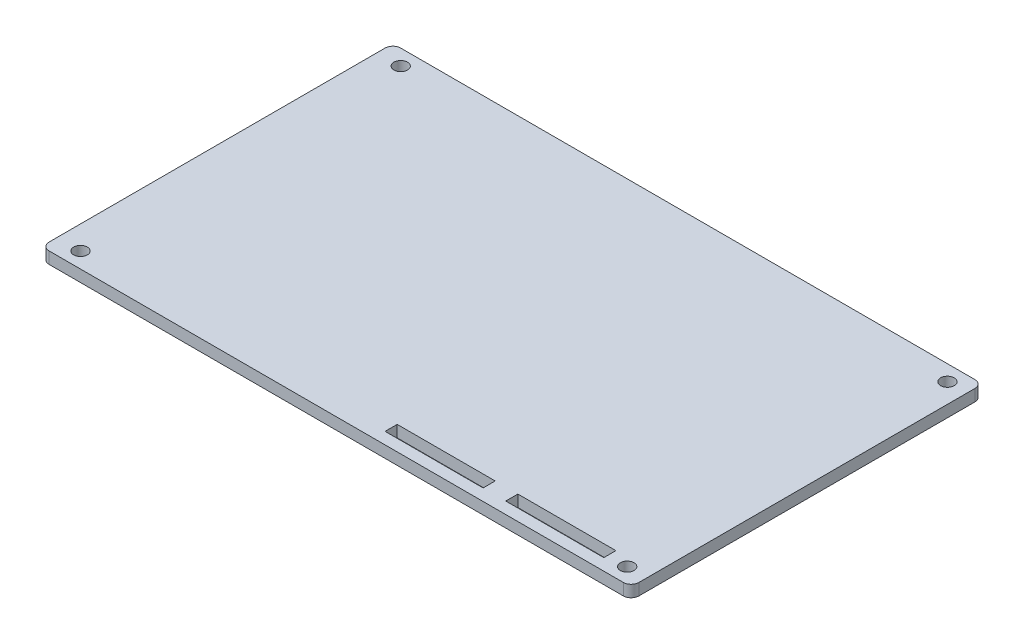
ISO-10303-21;
HEADER;
FILE_DESCRIPTION(('STEP AP214'),'2;1');
FILE_NAME('part.step','',(''),(''),'','','');
FILE_SCHEMA(('AUTOMOTIVE_DESIGN { 1 0 10303 214 1 1 1 1 }'));
ENDSEC;
DATA;
#1=APPLICATION_CONTEXT('core data for automotive mechanical design processes');
#2=APPLICATION_PROTOCOL_DEFINITION('international standard','automotive_design',2000,#1);
#3=PRODUCT_CONTEXT('',#1,'mechanical');
#4=PRODUCT('Part','Part','',(#3));
#5=PRODUCT_RELATED_PRODUCT_CATEGORY('part','',(#4));
#6=PRODUCT_DEFINITION_FORMATION('','',#4);
#7=PRODUCT_DEFINITION_CONTEXT('part definition',#1,'design');
#8=PRODUCT_DEFINITION('design','',#6,#7);
#9=PRODUCT_DEFINITION_SHAPE('','',#8);
#10=(LENGTH_UNIT() NAMED_UNIT(*) SI_UNIT(.MILLI.,.METRE.));
#11=(NAMED_UNIT(*) PLANE_ANGLE_UNIT() SI_UNIT($,.RADIAN.));
#12=(NAMED_UNIT(*) SI_UNIT($,.STERADIAN.) SOLID_ANGLE_UNIT());
#13=UNCERTAINTY_MEASURE_WITH_UNIT(LENGTH_MEASURE(1.E-05),#10,'distance_accuracy_value','');
#14=(GEOMETRIC_REPRESENTATION_CONTEXT(3) GLOBAL_UNCERTAINTY_ASSIGNED_CONTEXT((#13)) GLOBAL_UNIT_ASSIGNED_CONTEXT((#10,
#11,#12)) REPRESENTATION_CONTEXT('',''));
#15=CARTESIAN_POINT('',(0.,0.,0.));
#16=DIRECTION('',(0.,0.,1.));
#17=DIRECTION('',(1.,0.,0.));
#18=AXIS2_PLACEMENT_3D('',#15,#16,#17);
#19=CARTESIAN_POINT('',(0.,3.,0.));
#20=DIRECTION('',(1.,0.,0.));
#21=DIRECTION('',(0.,0.,-1.));
#22=AXIS2_PLACEMENT_3D('',#19,#20,#21);
#23=PLANE('',#22);
#24=DIRECTION('',(0.,0.,1.));
#25=VECTOR('',#24,1.);
#26=CARTESIAN_POINT('',(0.,0.,0.));
#27=LINE('',#26,#25);
#28=CARTESIAN_POINT('',(0.,0.,-88.));
#29=VERTEX_POINT('',#28);
#30=CARTESIAN_POINT('',(0.,0.,-2.));
#31=VERTEX_POINT('',#30);
#32=EDGE_CURVE('E279',#29,#31,#27,.T.);
#33=ORIENTED_EDGE('',*,*,#32,.T.);
#34=DIRECTION('',(0.,-1.,0.));
#35=VECTOR('',#34,1.);
#36=CARTESIAN_POINT('',(0.,3.,-2.));
#37=LINE('',#36,#35);
#38=CARTESIAN_POINT('',(0.,3.,-2.));
#39=VERTEX_POINT('',#38);
#40=EDGE_CURVE('E11',#31,#39,#37,.F.);
#41=ORIENTED_EDGE('',*,*,#40,.T.);
#42=DIRECTION('',(0.,0.,1.));
#43=VECTOR('',#42,1.);
#44=CARTESIAN_POINT('',(0.,3.,0.));
#45=LINE('',#44,#43);
#46=CARTESIAN_POINT('',(0.,3.,-88.));
#47=VERTEX_POINT('',#46);
#48=EDGE_CURVE('E283',#47,#39,#45,.T.);
#49=ORIENTED_EDGE('',*,*,#48,.F.);
#50=DIRECTION('',(0.,-1.,0.));
#51=VECTOR('',#50,1.);
#52=CARTESIAN_POINT('',(0.,3.,-88.));
#53=LINE('',#52,#51);
#54=EDGE_CURVE('E53',#47,#29,#53,.T.);
#55=ORIENTED_EDGE('',*,*,#54,.T.);
#56=EDGE_LOOP('',(#33,#41,#49,#55));
#57=FACE_BOUND('',#56,.T.);
#58=ADVANCED_FACE('F44',(#57),#23,.F.);
#59=CARTESIAN_POINT('',(0.,3.,0.));
#60=DIRECTION('',(0.,0.,-1.));
#61=DIRECTION('',(-1.,0.,0.));
#62=AXIS2_PLACEMENT_3D('',#59,#60,#61);
#63=PLANE('',#62);
#64=DIRECTION('',(1.,0.,0.));
#65=VECTOR('',#64,1.);
#66=CARTESIAN_POINT('',(0.,0.,0.));
#67=LINE('',#66,#65);
#68=CARTESIAN_POINT('',(2.,0.,0.));
#69=VERTEX_POINT('',#68);
#70=CARTESIAN_POINT('',(149.,0.,0.));
#71=VERTEX_POINT('',#70);
#72=EDGE_CURVE('E304',#69,#71,#67,.T.);
#73=ORIENTED_EDGE('',*,*,#72,.T.);
#74=DIRECTION('',(0.,-1.,0.));
#75=VECTOR('',#74,1.);
#76=CARTESIAN_POINT('',(149.,3.,0.));
#77=LINE('',#76,#75);
#78=CARTESIAN_POINT('',(149.,3.,0.));
#79=VERTEX_POINT('',#78);
#80=EDGE_CURVE('E356',#71,#79,#77,.F.);
#81=ORIENTED_EDGE('',*,*,#80,.T.);
#82=DIRECTION('',(1.,0.,0.));
#83=VECTOR('',#82,1.);
#84=CARTESIAN_POINT('',(0.,3.,0.));
#85=LINE('',#84,#83);
#86=CARTESIAN_POINT('',(2.,3.,0.));
#87=VERTEX_POINT('',#86);
#88=EDGE_CURVE('E287',#87,#79,#85,.T.);
#89=ORIENTED_EDGE('',*,*,#88,.F.);
#90=DIRECTION('',(0.,-1.,0.));
#91=VECTOR('',#90,1.);
#92=CARTESIAN_POINT('',(2.,3.,0.));
#93=LINE('',#92,#91);
#94=EDGE_CURVE('E352',#87,#69,#93,.T.);
#95=ORIENTED_EDGE('',*,*,#94,.T.);
#96=EDGE_LOOP('',(#73,#81,#89,#95));
#97=FACE_BOUND('',#96,.T.);
#98=ADVANCED_FACE('F376',(#97),#63,.F.);
#99=CARTESIAN_POINT('',(151.,3.,0.));
#100=DIRECTION('',(-1.,0.,0.));
#101=DIRECTION('',(0.,0.,1.));
#102=AXIS2_PLACEMENT_3D('',#99,#100,#101);
#103=PLANE('',#102);
#104=DIRECTION('',(0.,0.,-1.));
#105=VECTOR('',#104,1.);
#106=CARTESIAN_POINT('',(151.,0.,0.));
#107=LINE('',#106,#105);
#108=CARTESIAN_POINT('',(151.,0.,-2.));
#109=VERTEX_POINT('',#108);
#110=CARTESIAN_POINT('',(151.,0.,-88.));
#111=VERTEX_POINT('',#110);
#112=EDGE_CURVE('E308',#109,#111,#107,.T.);
#113=ORIENTED_EDGE('',*,*,#112,.T.);
#114=DIRECTION('',(0.,-1.,0.));
#115=VECTOR('',#114,1.);
#116=CARTESIAN_POINT('',(151.,3.,-88.));
#117=LINE('',#116,#115);
#118=CARTESIAN_POINT('',(151.,3.,-88.));
#119=VERTEX_POINT('',#118);
#120=EDGE_CURVE('E337',#111,#119,#117,.F.);
#121=ORIENTED_EDGE('',*,*,#120,.T.);
#122=DIRECTION('',(0.,0.,-1.));
#123=VECTOR('',#122,1.);
#124=CARTESIAN_POINT('',(151.,3.,0.));
#125=LINE('',#124,#123);
#126=CARTESIAN_POINT('',(151.,3.,-2.));
#127=VERTEX_POINT('',#126);
#128=EDGE_CURVE('E292',#127,#119,#125,.T.);
#129=ORIENTED_EDGE('',*,*,#128,.F.);
#130=DIRECTION('',(0.,-1.,0.));
#131=VECTOR('',#130,1.);
#132=CARTESIAN_POINT('',(151.,3.,-2.));
#133=LINE('',#132,#131);
#134=EDGE_CURVE('E333',#127,#109,#133,.T.);
#135=ORIENTED_EDGE('',*,*,#134,.T.);
#136=EDGE_LOOP('',(#113,#121,#129,#135));
#137=FACE_BOUND('',#136,.T.);
#138=ADVANCED_FACE('F387',(#137),#103,.F.);
#139=CARTESIAN_POINT('',(0.,3.,-90.));
#140=DIRECTION('',(0.,0.,1.));
#141=DIRECTION('',(1.,0.,0.));
#142=AXIS2_PLACEMENT_3D('',#139,#140,#141);
#143=PLANE('',#142);
#144=DIRECTION('',(-1.,0.,0.));
#145=VECTOR('',#144,1.);
#146=CARTESIAN_POINT('',(0.,3.,-90.));
#147=LINE('',#146,#145);
#148=CARTESIAN_POINT('',(149.,3.,-90.));
#149=VERTEX_POINT('',#148);
#150=CARTESIAN_POINT('',(2.,3.,-90.));
#151=VERTEX_POINT('',#150);
#152=EDGE_CURVE('E296',#149,#151,#147,.T.);
#153=ORIENTED_EDGE('',*,*,#152,.F.);
#154=DIRECTION('',(0.,-1.,0.));
#155=VECTOR('',#154,1.);
#156=CARTESIAN_POINT('',(149.,3.,-90.));
#157=LINE('',#156,#155);
#158=CARTESIAN_POINT('',(149.,0.,-90.));
#159=VERTEX_POINT('',#158);
#160=EDGE_CURVE('E317',#149,#159,#157,.T.);
#161=ORIENTED_EDGE('',*,*,#160,.T.);
#162=DIRECTION('',(-1.,0.,0.));
#163=VECTOR('',#162,1.);
#164=CARTESIAN_POINT('',(0.,0.,-90.));
#165=LINE('',#164,#163);
#166=CARTESIAN_POINT('',(2.,0.,-90.));
#167=VERTEX_POINT('',#166);
#168=EDGE_CURVE('E288',#159,#167,#165,.T.);
#169=ORIENTED_EDGE('',*,*,#168,.T.);
#170=DIRECTION('',(0.,-1.,0.));
#171=VECTOR('',#170,1.);
#172=CARTESIAN_POINT('',(2.,3.,-90.));
#173=LINE('',#172,#171);
#174=EDGE_CURVE('E300',#167,#151,#173,.F.);
#175=ORIENTED_EDGE('',*,*,#174,.T.);
#176=EDGE_LOOP('',(#153,#161,#169,#175));
#177=FACE_BOUND('',#176,.T.);
#178=ADVANCED_FACE('F395',(#177),#143,.F.);
#179=CARTESIAN_POINT('',(0.,3.,0.));
#180=DIRECTION('',(0.,-1.,0.));
#181=DIRECTION('',(0.,0.,-1.));
#182=AXIS2_PLACEMENT_3D('',#179,#180,#181);
#183=PLANE('',#182);
#184=DIRECTION('',(-1.,0.,0.));
#185=VECTOR('',#184,1.);
#186=CARTESIAN_POINT('',(141.,3.,-6.09999999999999));
#187=LINE('',#186,#185);
#188=CARTESIAN_POINT('',(141.,3.,-6.09999999999999));
#189=VERTEX_POINT('',#188);
#190=CARTESIAN_POINT('',(115.9,3.,-6.09999999999999));
#191=VERTEX_POINT('',#190);
#192=EDGE_CURVE('E194',#189,#191,#187,.T.);
#193=ORIENTED_EDGE('',*,*,#192,.F.);
#194=DIRECTION('',(0.,0.,-1.));
#195=VECTOR('',#194,1.);
#196=CARTESIAN_POINT('',(141.,3.,-3.));
#197=LINE('',#196,#195);
#198=CARTESIAN_POINT('',(141.,3.,-3.));
#199=VERTEX_POINT('',#198);
#200=EDGE_CURVE('E60',#199,#189,#197,.T.);
#201=ORIENTED_EDGE('',*,*,#200,.F.);
#202=DIRECTION('',(1.,0.,0.));
#203=VECTOR('',#202,1.);
#204=CARTESIAN_POINT('',(141.,3.,-3.));
#205=LINE('',#204,#203);
#206=CARTESIAN_POINT('',(115.9,3.,-3.));
#207=VERTEX_POINT('',#206);
#208=EDGE_CURVE('E181',#207,#199,#205,.T.);
#209=ORIENTED_EDGE('',*,*,#208,.F.);
#210=DIRECTION('',(0.,0.,1.));
#211=VECTOR('',#210,1.);
#212=CARTESIAN_POINT('',(115.9,3.,-3.));
#213=LINE('',#212,#211);
#214=EDGE_CURVE('E185',#191,#207,#213,.T.);
#215=ORIENTED_EDGE('',*,*,#214,.F.);
#216=EDGE_LOOP('',(#193,#201,#209,#215));
#217=FACE_BOUND('',#216,.T.);
#218=DIRECTION('',(1.,0.,0.));
#219=VECTOR('',#218,1.);
#220=CARTESIAN_POINT('',(85.,3.,-2.99999999999999));
#221=LINE('',#220,#219);
#222=CARTESIAN_POINT('',(85.,3.,-2.99999999999999));
#223=VERTEX_POINT('',#222);
#224=CARTESIAN_POINT('',(110.1,3.,-2.99999999999999));
#225=VERTEX_POINT('',#224);
#226=EDGE_CURVE('E231',#223,#225,#221,.T.);
#227=ORIENTED_EDGE('',*,*,#226,.F.);
#228=DIRECTION('',(0.,0.,1.));
#229=VECTOR('',#228,1.);
#230=CARTESIAN_POINT('',(85.,3.,-2.99999999999999));
#231=LINE('',#230,#229);
#232=CARTESIAN_POINT('',(85.,3.,-6.09999999999999));
#233=VERTEX_POINT('',#232);
#234=EDGE_CURVE('E68',#233,#223,#231,.T.);
#235=ORIENTED_EDGE('',*,*,#234,.F.);
#236=DIRECTION('',(-1.,0.,0.));
#237=VECTOR('',#236,1.);
#238=CARTESIAN_POINT('',(85.,3.,-6.09999999999999));
#239=LINE('',#238,#237);
#240=CARTESIAN_POINT('',(110.1,3.,-6.09999999999999));
#241=VERTEX_POINT('',#240);
#242=EDGE_CURVE('E222',#241,#233,#239,.T.);
#243=ORIENTED_EDGE('',*,*,#242,.F.);
#244=DIRECTION('',(0.,0.,-1.));
#245=VECTOR('',#244,1.);
#246=CARTESIAN_POINT('',(110.1,3.,-2.99999999999999));
#247=LINE('',#246,#245);
#248=EDGE_CURVE('E226',#225,#241,#247,.T.);
#249=ORIENTED_EDGE('',*,*,#248,.F.);
#250=EDGE_LOOP('',(#227,#235,#243,#249));
#251=FACE_BOUND('',#250,.T.);
#252=CARTESIAN_POINT('',(146.,3.,-4.));
#253=DIRECTION('',(0.,1.,0.));
#254=DIRECTION('',(0.,0.,1.));
#255=AXIS2_PLACEMENT_3D('',#252,#253,#254);
#256=CIRCLE('',#255,1.75000000000001);
#257=CARTESIAN_POINT('',(146.,3.,-2.24999999999999));
#258=VERTEX_POINT('',#257);
#259=EDGE_CURVE('E259',#258,#258,#256,.T.);
#260=ORIENTED_EDGE('',*,*,#259,.F.);
#261=EDGE_LOOP('',(#260));
#262=FACE_BOUND('',#261,.T.);
#263=CARTESIAN_POINT('',(6.,3.,-86.));
#264=DIRECTION('',(0.,1.,0.));
#265=DIRECTION('',(0.,0.,1.));
#266=AXIS2_PLACEMENT_3D('',#263,#264,#265);
#267=CIRCLE('',#266,1.75);
#268=CARTESIAN_POINT('',(6.,3.,-84.25));
#269=VERTEX_POINT('',#268);
#270=EDGE_CURVE('E268',#269,#269,#267,.T.);
#271=ORIENTED_EDGE('',*,*,#270,.F.);
#272=EDGE_LOOP('',(#271));
#273=FACE_BOUND('',#272,.T.);
#274=CARTESIAN_POINT('',(6.,3.,-4.));
#275=DIRECTION('',(0.,1.,0.));
#276=DIRECTION('',(0.,0.,1.));
#277=AXIS2_PLACEMENT_3D('',#274,#275,#276);
#278=CIRCLE('',#277,1.75);
#279=CARTESIAN_POINT('',(6.,3.,-2.25));
#280=VERTEX_POINT('',#279);
#281=EDGE_CURVE('E251',#280,#280,#278,.T.);
#282=ORIENTED_EDGE('',*,*,#281,.F.);
#283=EDGE_LOOP('',(#282));
#284=FACE_BOUND('',#283,.T.);
#285=CARTESIAN_POINT('',(146.,3.,-86.));
#286=DIRECTION('',(0.,1.,0.));
#287=DIRECTION('',(0.,0.,1.));
#288=AXIS2_PLACEMENT_3D('',#285,#286,#287);
#289=CIRCLE('',#288,1.75000000000001);
#290=CARTESIAN_POINT('',(146.,3.,-84.25));
#291=VERTEX_POINT('',#290);
#292=EDGE_CURVE('E263',#291,#291,#289,.T.);
#293=ORIENTED_EDGE('',*,*,#292,.F.);
#294=EDGE_LOOP('',(#293));
#295=FACE_BOUND('',#294,.T.);
#296=ORIENTED_EDGE('',*,*,#128,.T.);
#297=CARTESIAN_POINT('',(149.,3.,-88.));
#298=DIRECTION('',(0.,-1.,0.));
#299=DIRECTION('',(0.,0.,-1.));
#300=AXIS2_PLACEMENT_3D('',#297,#298,#299);
#301=CIRCLE('',#300,2.);
#302=EDGE_CURVE('E349',#119,#149,#301,.F.);
#303=ORIENTED_EDGE('',*,*,#302,.T.);
#304=ORIENTED_EDGE('',*,*,#152,.T.);
#305=CARTESIAN_POINT('',(2.,3.,-88.));
#306=DIRECTION('',(0.,-1.,0.));
#307=DIRECTION('',(0.,0.,-1.));
#308=AXIS2_PLACEMENT_3D('',#305,#306,#307);
#309=CIRCLE('',#308,2.);
#310=EDGE_CURVE('E340',#151,#47,#309,.F.);
#311=ORIENTED_EDGE('',*,*,#310,.T.);
#312=ORIENTED_EDGE('',*,*,#48,.T.);
#313=CARTESIAN_POINT('',(2.,3.,-2.));
#314=DIRECTION('',(0.,-1.,0.));
#315=DIRECTION('',(0.,0.,-1.));
#316=AXIS2_PLACEMENT_3D('',#313,#314,#315);
#317=CIRCLE('',#316,2.);
#318=EDGE_CURVE('E343',#39,#87,#317,.F.);
#319=ORIENTED_EDGE('',*,*,#318,.T.);
#320=ORIENTED_EDGE('',*,*,#88,.T.);
#321=CARTESIAN_POINT('',(149.,3.,-2.));
#322=DIRECTION('',(0.,-1.,0.));
#323=DIRECTION('',(0.,0.,-1.));
#324=AXIS2_PLACEMENT_3D('',#321,#322,#323);
#325=CIRCLE('',#324,2.);
#326=EDGE_CURVE('E346',#79,#127,#325,.F.);
#327=ORIENTED_EDGE('',*,*,#326,.T.);
#328=EDGE_LOOP('',(#296,#303,#304,#311,#312,#319,#320,#327));
#329=FACE_BOUND('',#328,.T.);
#330=ADVANCED_FACE('F380',(#217,#251,#262,#273,#284,#295,#329),#183,.F.);
#331=CARTESIAN_POINT('',(0.,0.,0.));
#332=DIRECTION('',(0.,-1.,0.));
#333=DIRECTION('',(0.,0.,-1.));
#334=AXIS2_PLACEMENT_3D('',#331,#332,#333);
#335=PLANE('',#334);
#336=DIRECTION('',(0.,0.,-1.));
#337=VECTOR('',#336,1.);
#338=CARTESIAN_POINT('',(141.,0.,-3.));
#339=LINE('',#338,#337);
#340=CARTESIAN_POINT('',(141.,0.,-3.));
#341=VERTEX_POINT('',#340);
#342=CARTESIAN_POINT('',(141.,0.,-6.09999999999999));
#343=VERTEX_POINT('',#342);
#344=EDGE_CURVE('E159',#341,#343,#339,.T.);
#345=ORIENTED_EDGE('',*,*,#344,.T.);
#346=DIRECTION('',(-1.,0.,0.));
#347=VECTOR('',#346,1.);
#348=CARTESIAN_POINT('',(141.,0.,-6.09999999999999));
#349=LINE('',#348,#347);
#350=CARTESIAN_POINT('',(115.9,0.,-6.09999999999999));
#351=VERTEX_POINT('',#350);
#352=EDGE_CURVE('E170',#343,#351,#349,.T.);
#353=ORIENTED_EDGE('',*,*,#352,.T.);
#354=DIRECTION('',(0.,0.,1.));
#355=VECTOR('',#354,1.);
#356=CARTESIAN_POINT('',(115.9,0.,-3.));
#357=LINE('',#356,#355);
#358=CARTESIAN_POINT('',(115.9,0.,-3.));
#359=VERTEX_POINT('',#358);
#360=EDGE_CURVE('E175',#351,#359,#357,.T.);
#361=ORIENTED_EDGE('',*,*,#360,.T.);
#362=DIRECTION('',(1.,0.,0.));
#363=VECTOR('',#362,1.);
#364=CARTESIAN_POINT('',(141.,0.,-3.));
#365=LINE('',#364,#363);
#366=EDGE_CURVE('E166',#359,#341,#365,.T.);
#367=ORIENTED_EDGE('',*,*,#366,.T.);
#368=EDGE_LOOP('',(#345,#353,#361,#367));
#369=FACE_BOUND('',#368,.T.);
#370=DIRECTION('',(0.,0.,1.));
#371=VECTOR('',#370,1.);
#372=CARTESIAN_POINT('',(85.,0.,-2.99999999999999));
#373=LINE('',#372,#371);
#374=CARTESIAN_POINT('',(85.,0.,-6.09999999999999));
#375=VERTEX_POINT('',#374);
#376=CARTESIAN_POINT('',(85.,0.,-2.99999999999999));
#377=VERTEX_POINT('',#376);
#378=EDGE_CURVE('E227',#375,#377,#373,.T.);
#379=ORIENTED_EDGE('',*,*,#378,.T.);
#380=DIRECTION('',(1.,0.,0.));
#381=VECTOR('',#380,1.);
#382=CARTESIAN_POINT('',(85.,0.,-2.99999999999999));
#383=LINE('',#382,#381);
#384=CARTESIAN_POINT('',(110.1,0.,-2.99999999999999));
#385=VERTEX_POINT('',#384);
#386=EDGE_CURVE('E244',#377,#385,#383,.T.);
#387=ORIENTED_EDGE('',*,*,#386,.T.);
#388=DIRECTION('',(0.,0.,-1.));
#389=VECTOR('',#388,1.);
#390=CARTESIAN_POINT('',(110.1,0.,-2.99999999999999));
#391=LINE('',#390,#389);
#392=CARTESIAN_POINT('',(110.1,0.,-6.09999999999999));
#393=VERTEX_POINT('',#392);
#394=EDGE_CURVE('E240',#385,#393,#391,.T.);
#395=ORIENTED_EDGE('',*,*,#394,.T.);
#396=DIRECTION('',(-1.,0.,0.));
#397=VECTOR('',#396,1.);
#398=CARTESIAN_POINT('',(85.,0.,-6.09999999999999));
#399=LINE('',#398,#397);
#400=EDGE_CURVE('E212',#393,#375,#399,.T.);
#401=ORIENTED_EDGE('',*,*,#400,.T.);
#402=EDGE_LOOP('',(#379,#387,#395,#401));
#403=FACE_BOUND('',#402,.T.);
#404=CARTESIAN_POINT('',(146.,0.,-4.));
#405=DIRECTION('',(0.,1.,0.));
#406=DIRECTION('',(0.,0.,1.));
#407=AXIS2_PLACEMENT_3D('',#404,#405,#406);
#408=CIRCLE('',#407,1.75000000000001);
#409=CARTESIAN_POINT('',(146.,0.,-2.24999999999999));
#410=VERTEX_POINT('',#409);
#411=EDGE_CURVE('E264',#410,#410,#408,.T.);
#412=ORIENTED_EDGE('',*,*,#411,.T.);
#413=EDGE_LOOP('',(#412));
#414=FACE_BOUND('',#413,.T.);
#415=CARTESIAN_POINT('',(6.,0.,-86.));
#416=DIRECTION('',(0.,1.,0.));
#417=DIRECTION('',(0.,0.,1.));
#418=AXIS2_PLACEMENT_3D('',#415,#416,#417);
#419=CIRCLE('',#418,1.75);
#420=CARTESIAN_POINT('',(6.,0.,-84.25));
#421=VERTEX_POINT('',#420);
#422=EDGE_CURVE('E255',#421,#421,#419,.T.);
#423=ORIENTED_EDGE('',*,*,#422,.T.);
#424=EDGE_LOOP('',(#423));
#425=FACE_BOUND('',#424,.T.);
#426=CARTESIAN_POINT('',(6.,0.,-4.));
#427=DIRECTION('',(0.,1.,0.));
#428=DIRECTION('',(0.,0.,1.));
#429=AXIS2_PLACEMENT_3D('',#426,#427,#428);
#430=CIRCLE('',#429,1.75);
#431=CARTESIAN_POINT('',(6.,0.,-2.25));
#432=VERTEX_POINT('',#431);
#433=EDGE_CURVE('E203',#432,#432,#430,.T.);
#434=ORIENTED_EDGE('',*,*,#433,.T.);
#435=EDGE_LOOP('',(#434));
#436=FACE_BOUND('',#435,.T.);
#437=CARTESIAN_POINT('',(146.,0.,-86.));
#438=DIRECTION('',(0.,1.,0.));
#439=DIRECTION('',(0.,0.,1.));
#440=AXIS2_PLACEMENT_3D('',#437,#438,#439);
#441=CIRCLE('',#440,1.75000000000001);
#442=CARTESIAN_POINT('',(146.,0.,-84.25));
#443=VERTEX_POINT('',#442);
#444=EDGE_CURVE('E275',#443,#443,#441,.T.);
#445=ORIENTED_EDGE('',*,*,#444,.T.);
#446=EDGE_LOOP('',(#445));
#447=FACE_BOUND('',#446,.T.);
#448=ORIENTED_EDGE('',*,*,#168,.F.);
#449=CARTESIAN_POINT('',(149.,0.,-88.));
#450=DIRECTION('',(0.,-1.,0.));
#451=DIRECTION('',(0.,0.,-1.));
#452=AXIS2_PLACEMENT_3D('',#449,#450,#451);
#453=CIRCLE('',#452,2.);
#454=EDGE_CURVE('E330',#159,#111,#453,.T.);
#455=ORIENTED_EDGE('',*,*,#454,.T.);
#456=ORIENTED_EDGE('',*,*,#112,.F.);
#457=CARTESIAN_POINT('',(149.,0.,-2.));
#458=DIRECTION('',(0.,-1.,0.));
#459=DIRECTION('',(0.,0.,-1.));
#460=AXIS2_PLACEMENT_3D('',#457,#458,#459);
#461=CIRCLE('',#460,2.);
#462=EDGE_CURVE('E327',#109,#71,#461,.T.);
#463=ORIENTED_EDGE('',*,*,#462,.T.);
#464=ORIENTED_EDGE('',*,*,#72,.F.);
#465=CARTESIAN_POINT('',(2.,0.,-2.));
#466=DIRECTION('',(0.,-1.,0.));
#467=DIRECTION('',(0.,0.,-1.));
#468=AXIS2_PLACEMENT_3D('',#465,#466,#467);
#469=CIRCLE('',#468,2.);
#470=EDGE_CURVE('E324',#69,#31,#469,.T.);
#471=ORIENTED_EDGE('',*,*,#470,.T.);
#472=ORIENTED_EDGE('',*,*,#32,.F.);
#473=CARTESIAN_POINT('',(2.,0.,-88.));
#474=DIRECTION('',(0.,-1.,0.));
#475=DIRECTION('',(0.,0.,-1.));
#476=AXIS2_PLACEMENT_3D('',#473,#474,#475);
#477=CIRCLE('',#476,2.);
#478=EDGE_CURVE('E321',#29,#167,#477,.T.);
#479=ORIENTED_EDGE('',*,*,#478,.T.);
#480=EDGE_LOOP('',(#448,#455,#456,#463,#464,#471,#472,#479));
#481=FACE_BOUND('',#480,.T.);
#482=ADVANCED_FACE('F177',(#369,#403,#414,#425,#436,#447,#481),#335,.T.);
#483=CARTESIAN_POINT('',(146.,0.,-86.));
#484=DIRECTION('',(0.,1.,0.));
#485=DIRECTION('',(0.,0.,1.));
#486=AXIS2_PLACEMENT_3D('',#483,#484,#485);
#487=CYLINDRICAL_SURFACE('',#486,1.75000000000001);
#488=ORIENTED_EDGE('',*,*,#444,.F.);
#489=EDGE_LOOP('',(#488));
#490=FACE_BOUND('',#489,.T.);
#491=ORIENTED_EDGE('',*,*,#292,.T.);
#492=EDGE_LOOP('',(#491));
#493=FACE_BOUND('',#492,.T.);
#494=ADVANCED_FACE('F514',(#490,#493),#487,.F.);
#495=CARTESIAN_POINT('',(6.,0.,-4.));
#496=DIRECTION('',(0.,1.,0.));
#497=DIRECTION('',(0.,0.,1.));
#498=AXIS2_PLACEMENT_3D('',#495,#496,#497);
#499=CYLINDRICAL_SURFACE('',#498,1.75);
#500=ORIENTED_EDGE('',*,*,#433,.F.);
#501=EDGE_LOOP('',(#500));
#502=FACE_BOUND('',#501,.T.);
#503=ORIENTED_EDGE('',*,*,#281,.T.);
#504=EDGE_LOOP('',(#503));
#505=FACE_BOUND('',#504,.T.);
#506=ADVANCED_FACE('F510',(#502,#505),#499,.F.);
#507=CARTESIAN_POINT('',(6.,0.,-86.));
#508=DIRECTION('',(0.,1.,0.));
#509=DIRECTION('',(0.,0.,1.));
#510=AXIS2_PLACEMENT_3D('',#507,#508,#509);
#511=CYLINDRICAL_SURFACE('',#510,1.75);
#512=ORIENTED_EDGE('',*,*,#422,.F.);
#513=EDGE_LOOP('',(#512));
#514=FACE_BOUND('',#513,.T.);
#515=ORIENTED_EDGE('',*,*,#270,.T.);
#516=EDGE_LOOP('',(#515));
#517=FACE_BOUND('',#516,.T.);
#518=ADVANCED_FACE('F513',(#514,#517),#511,.F.);
#519=CARTESIAN_POINT('',(146.,0.,-4.));
#520=DIRECTION('',(0.,1.,0.));
#521=DIRECTION('',(0.,0.,1.));
#522=AXIS2_PLACEMENT_3D('',#519,#520,#521);
#523=CYLINDRICAL_SURFACE('',#522,1.75000000000001);
#524=ORIENTED_EDGE('',*,*,#411,.F.);
#525=EDGE_LOOP('',(#524));
#526=FACE_BOUND('',#525,.T.);
#527=ORIENTED_EDGE('',*,*,#259,.T.);
#528=EDGE_LOOP('',(#527));
#529=FACE_BOUND('',#528,.T.);
#530=ADVANCED_FACE('F417',(#526,#529),#523,.F.);
#531=CARTESIAN_POINT('',(149.,3.,-88.));
#532=DIRECTION('',(0.,-1.,0.));
#533=DIRECTION('',(0.,0.,-1.));
#534=AXIS2_PLACEMENT_3D('',#531,#532,#533);
#535=CYLINDRICAL_SURFACE('',#534,2.);
#536=ORIENTED_EDGE('',*,*,#302,.F.);
#537=ORIENTED_EDGE('',*,*,#120,.F.);
#538=ORIENTED_EDGE('',*,*,#454,.F.);
#539=ORIENTED_EDGE('',*,*,#160,.F.);
#540=EDGE_LOOP('',(#536,#537,#538,#539));
#541=FACE_BOUND('',#540,.T.);
#542=ADVANCED_FACE('F392',(#541),#535,.T.);
#543=CARTESIAN_POINT('',(149.,3.,-2.));
#544=DIRECTION('',(0.,-1.,0.));
#545=DIRECTION('',(0.,0.,-1.));
#546=AXIS2_PLACEMENT_3D('',#543,#544,#545);
#547=CYLINDRICAL_SURFACE('',#546,2.);
#548=ORIENTED_EDGE('',*,*,#326,.F.);
#549=ORIENTED_EDGE('',*,*,#80,.F.);
#550=ORIENTED_EDGE('',*,*,#462,.F.);
#551=ORIENTED_EDGE('',*,*,#134,.F.);
#552=EDGE_LOOP('',(#548,#549,#550,#551));
#553=FACE_BOUND('',#552,.T.);
#554=ADVANCED_FACE('F384',(#553),#547,.T.);
#555=CARTESIAN_POINT('',(2.,3.,-2.));
#556=DIRECTION('',(0.,-1.,0.));
#557=DIRECTION('',(0.,0.,-1.));
#558=AXIS2_PLACEMENT_3D('',#555,#556,#557);
#559=CYLINDRICAL_SURFACE('',#558,2.);
#560=ORIENTED_EDGE('',*,*,#318,.F.);
#561=ORIENTED_EDGE('',*,*,#40,.F.);
#562=ORIENTED_EDGE('',*,*,#470,.F.);
#563=ORIENTED_EDGE('',*,*,#94,.F.);
#564=EDGE_LOOP('',(#560,#561,#562,#563));
#565=FACE_BOUND('',#564,.T.);
#566=ADVANCED_FACE('F373',(#565),#559,.T.);
#567=CARTESIAN_POINT('',(2.,3.,-88.));
#568=DIRECTION('',(0.,-1.,0.));
#569=DIRECTION('',(0.,0.,-1.));
#570=AXIS2_PLACEMENT_3D('',#567,#568,#569);
#571=CYLINDRICAL_SURFACE('',#570,2.);
#572=ORIENTED_EDGE('',*,*,#310,.F.);
#573=ORIENTED_EDGE('',*,*,#174,.F.);
#574=ORIENTED_EDGE('',*,*,#478,.F.);
#575=ORIENTED_EDGE('',*,*,#54,.F.);
#576=EDGE_LOOP('',(#572,#573,#574,#575));
#577=FACE_BOUND('',#576,.T.);
#578=ADVANCED_FACE('F46',(#577),#571,.T.);
#579=CARTESIAN_POINT('',(85.,0.,-2.99999999999999));
#580=DIRECTION('',(-1.,0.,0.));
#581=DIRECTION('',(0.,0.,1.));
#582=AXIS2_PLACEMENT_3D('',#579,#580,#581);
#583=PLANE('',#582);
#584=ORIENTED_EDGE('',*,*,#234,.T.);
#585=DIRECTION('',(0.,1.,0.));
#586=VECTOR('',#585,1.);
#587=CARTESIAN_POINT('',(85.,0.,-2.99999999999999));
#588=LINE('',#587,#586);
#589=EDGE_CURVE('E209',#377,#223,#588,.T.);
#590=ORIENTED_EDGE('',*,*,#589,.F.);
#591=ORIENTED_EDGE('',*,*,#378,.F.);
#592=DIRECTION('',(0.,1.,0.));
#593=VECTOR('',#592,1.);
#594=CARTESIAN_POINT('',(85.,0.,-6.09999999999999));
#595=LINE('',#594,#593);
#596=EDGE_CURVE('E219',#375,#233,#595,.T.);
#597=ORIENTED_EDGE('',*,*,#596,.T.);
#598=EDGE_LOOP('',(#584,#590,#591,#597));
#599=FACE_BOUND('',#598,.T.);
#600=ADVANCED_FACE('F398',(#599),#583,.F.);
#601=CARTESIAN_POINT('',(85.,0.,-6.09999999999999));
#602=DIRECTION('',(0.,0.,-1.));
#603=DIRECTION('',(-1.,0.,0.));
#604=AXIS2_PLACEMENT_3D('',#601,#602,#603);
#605=PLANE('',#604);
#606=ORIENTED_EDGE('',*,*,#242,.T.);
#607=ORIENTED_EDGE('',*,*,#596,.F.);
#608=ORIENTED_EDGE('',*,*,#400,.F.);
#609=DIRECTION('',(0.,1.,0.));
#610=VECTOR('',#609,1.);
#611=CARTESIAN_POINT('',(110.1,0.,-6.09999999999999));
#612=LINE('',#611,#610);
#613=EDGE_CURVE('E216',#393,#241,#612,.T.);
#614=ORIENTED_EDGE('',*,*,#613,.T.);
#615=EDGE_LOOP('',(#606,#607,#608,#614));
#616=FACE_BOUND('',#615,.T.);
#617=ADVANCED_FACE('F404',(#616),#605,.F.);
#618=CARTESIAN_POINT('',(110.1,0.,-2.99999999999999));
#619=DIRECTION('',(1.,0.,0.));
#620=DIRECTION('',(0.,0.,-1.));
#621=AXIS2_PLACEMENT_3D('',#618,#619,#620);
#622=PLANE('',#621);
#623=ORIENTED_EDGE('',*,*,#248,.T.);
#624=ORIENTED_EDGE('',*,*,#613,.F.);
#625=ORIENTED_EDGE('',*,*,#394,.F.);
#626=DIRECTION('',(0.,1.,0.));
#627=VECTOR('',#626,1.);
#628=CARTESIAN_POINT('',(110.1,0.,-2.99999999999999));
#629=LINE('',#628,#627);
#630=EDGE_CURVE('E213',#385,#225,#629,.T.);
#631=ORIENTED_EDGE('',*,*,#630,.T.);
#632=EDGE_LOOP('',(#623,#624,#625,#631));
#633=FACE_BOUND('',#632,.T.);
#634=ADVANCED_FACE('F450',(#633),#622,.F.);
#635=CARTESIAN_POINT('',(85.,0.,-2.99999999999999));
#636=DIRECTION('',(0.,0.,1.));
#637=DIRECTION('',(1.,0.,0.));
#638=AXIS2_PLACEMENT_3D('',#635,#636,#637);
#639=PLANE('',#638);
#640=ORIENTED_EDGE('',*,*,#226,.T.);
#641=ORIENTED_EDGE('',*,*,#630,.F.);
#642=ORIENTED_EDGE('',*,*,#386,.F.);
#643=ORIENTED_EDGE('',*,*,#589,.T.);
#644=EDGE_LOOP('',(#640,#641,#642,#643));
#645=FACE_BOUND('',#644,.T.);
#646=ADVANCED_FACE('F460',(#645),#639,.F.);
#647=CARTESIAN_POINT('',(141.,0.,-3.));
#648=DIRECTION('',(1.,0.,0.));
#649=DIRECTION('',(0.,0.,-1.));
#650=AXIS2_PLACEMENT_3D('',#647,#648,#649);
#651=PLANE('',#650);
#652=ORIENTED_EDGE('',*,*,#200,.T.);
#653=DIRECTION('',(0.,1.,0.));
#654=VECTOR('',#653,1.);
#655=CARTESIAN_POINT('',(141.,0.,-6.09999999999999));
#656=LINE('',#655,#654);
#657=EDGE_CURVE('E155',#343,#189,#656,.T.);
#658=ORIENTED_EDGE('',*,*,#657,.F.);
#659=ORIENTED_EDGE('',*,*,#344,.F.);
#660=DIRECTION('',(0.,1.,0.));
#661=VECTOR('',#660,1.);
#662=CARTESIAN_POINT('',(141.,0.,-3.));
#663=LINE('',#662,#661);
#664=EDGE_CURVE('E200',#341,#199,#663,.T.);
#665=ORIENTED_EDGE('',*,*,#664,.T.);
#666=EDGE_LOOP('',(#652,#658,#659,#665));
#667=FACE_BOUND('',#666,.T.);
#668=ADVANCED_FACE('F157',(#667),#651,.F.);
#669=CARTESIAN_POINT('',(141.,0.,-3.));
#670=DIRECTION('',(0.,0.,1.));
#671=DIRECTION('',(1.,0.,0.));
#672=AXIS2_PLACEMENT_3D('',#669,#670,#671);
#673=PLANE('',#672);
#674=ORIENTED_EDGE('',*,*,#208,.T.);
#675=ORIENTED_EDGE('',*,*,#664,.F.);
#676=ORIENTED_EDGE('',*,*,#366,.F.);
#677=DIRECTION('',(0.,1.,0.));
#678=VECTOR('',#677,1.);
#679=CARTESIAN_POINT('',(115.9,0.,-3.));
#680=LINE('',#679,#678);
#681=EDGE_CURVE('E204',#359,#207,#680,.T.);
#682=ORIENTED_EDGE('',*,*,#681,.T.);
#683=EDGE_LOOP('',(#674,#675,#676,#682));
#684=FACE_BOUND('',#683,.T.);
#685=ADVANCED_FACE('F479',(#684),#673,.F.);
#686=CARTESIAN_POINT('',(115.9,0.,-3.));
#687=DIRECTION('',(-1.,0.,0.));
#688=DIRECTION('',(0.,0.,1.));
#689=AXIS2_PLACEMENT_3D('',#686,#687,#688);
#690=PLANE('',#689);
#691=ORIENTED_EDGE('',*,*,#214,.T.);
#692=ORIENTED_EDGE('',*,*,#681,.F.);
#693=ORIENTED_EDGE('',*,*,#360,.F.);
#694=DIRECTION('',(0.,1.,0.));
#695=VECTOR('',#694,1.);
#696=CARTESIAN_POINT('',(115.9,0.,-6.09999999999999));
#697=LINE('',#696,#695);
#698=EDGE_CURVE('E165',#351,#191,#697,.T.);
#699=ORIENTED_EDGE('',*,*,#698,.T.);
#700=EDGE_LOOP('',(#691,#692,#693,#699));
#701=FACE_BOUND('',#700,.T.);
#702=ADVANCED_FACE('F488',(#701),#690,.F.);
#703=CARTESIAN_POINT('',(141.,0.,-6.09999999999999));
#704=DIRECTION('',(0.,0.,-1.));
#705=DIRECTION('',(-1.,0.,0.));
#706=AXIS2_PLACEMENT_3D('',#703,#704,#705);
#707=PLANE('',#706);
#708=ORIENTED_EDGE('',*,*,#192,.T.);
#709=ORIENTED_EDGE('',*,*,#698,.F.);
#710=ORIENTED_EDGE('',*,*,#352,.F.);
#711=ORIENTED_EDGE('',*,*,#657,.T.);
#712=EDGE_LOOP('',(#708,#709,#710,#711));
#713=FACE_BOUND('',#712,.T.);
#714=ADVANCED_FACE('F171',(#713),#707,.F.);
#715=CLOSED_SHELL('',(#58,#98,#138,#178,#330,#482,#494,#506,#518,#530,#542,#554,#566,#578,#600,
#617,#634,#646,#668,#685,#702,#714));
#716=MANIFOLD_SOLID_BREP('B2',#715);
#717=ADVANCED_BREP_SHAPE_REPRESENTATION('',(#18,#716),#14);
#718=SHAPE_DEFINITION_REPRESENTATION(#9,#717);
ENDSEC;
END-ISO-10303-21;
